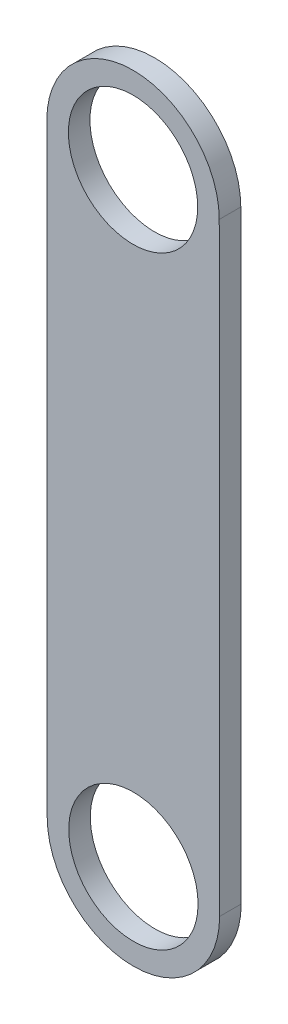
ISO-10303-21;
HEADER;
FILE_DESCRIPTION(('STEP AP214'),'2;1');
FILE_NAME('part.step','',(''),(''),'','','');
FILE_SCHEMA(('AUTOMOTIVE_DESIGN { 1 0 10303 214 1 1 1 1 }'));
ENDSEC;
DATA;
#1=APPLICATION_CONTEXT('core data for automotive mechanical design processes');
#2=APPLICATION_PROTOCOL_DEFINITION('international standard','automotive_design',2000,#1);
#3=PRODUCT_CONTEXT('',#1,'mechanical');
#4=PRODUCT('Part','Part','',(#3));
#5=PRODUCT_RELATED_PRODUCT_CATEGORY('part','',(#4));
#6=PRODUCT_DEFINITION_FORMATION('','',#4);
#7=PRODUCT_DEFINITION_CONTEXT('part definition',#1,'design');
#8=PRODUCT_DEFINITION('design','',#6,#7);
#9=PRODUCT_DEFINITION_SHAPE('','',#8);
#10=(LENGTH_UNIT() NAMED_UNIT(*) SI_UNIT(.MILLI.,.METRE.));
#11=(NAMED_UNIT(*) PLANE_ANGLE_UNIT() SI_UNIT($,.RADIAN.));
#12=(NAMED_UNIT(*) SI_UNIT($,.STERADIAN.) SOLID_ANGLE_UNIT());
#13=UNCERTAINTY_MEASURE_WITH_UNIT(LENGTH_MEASURE(1.E-05),#10,'distance_accuracy_value','');
#14=(GEOMETRIC_REPRESENTATION_CONTEXT(3) GLOBAL_UNCERTAINTY_ASSIGNED_CONTEXT((#13)) GLOBAL_UNIT_ASSIGNED_CONTEXT((#10,
#11,#12)) REPRESENTATION_CONTEXT('',''));
#15=CARTESIAN_POINT('',(0.,0.,0.));
#16=DIRECTION('',(0.,0.,1.));
#17=DIRECTION('',(1.,0.,0.));
#18=AXIS2_PLACEMENT_3D('',#15,#16,#17);
#19=CARTESIAN_POINT('',(-54.484155585902,-22.2361374727643,-1.));
#20=DIRECTION('',(0.,0.,1.));
#21=DIRECTION('',(1.,0.,0.));
#22=AXIS2_PLACEMENT_3D('',#19,#20,#21);
#23=CYLINDRICAL_SURFACE('',#22,4.00000000000001);
#24=CARTESIAN_POINT('',(-54.484155585902,-22.2361374727643,0.));
#25=DIRECTION('',(0.,0.,1.));
#26=DIRECTION('',(1.,0.,0.));
#27=AXIS2_PLACEMENT_3D('',#24,#25,#26);
#28=CIRCLE('',#27,4.00000000000001);
#29=CARTESIAN_POINT('',(-50.4841563307259,-22.2336964503954,0.));
#30=VERTEX_POINT('',#29);
#31=CARTESIAN_POINT('',(-58.4841548410782,-22.2385784951332,0.));
#32=VERTEX_POINT('',#31);
#33=EDGE_CURVE('E106',#30,#32,#28,.T.);
#34=ORIENTED_EDGE('',*,*,#33,.F.);
#35=DIRECTION('',(0.,0.,1.));
#36=VECTOR('',#35,1.);
#37=CARTESIAN_POINT('',(-50.4841563307259,-22.2336964503954,-1.));
#38=LINE('',#37,#36);
#39=CARTESIAN_POINT('',(-50.4841563307259,-22.2336964503954,-1.));
#40=VERTEX_POINT('',#39);
#41=EDGE_CURVE('E11',#40,#30,#38,.T.);
#42=ORIENTED_EDGE('',*,*,#41,.F.);
#43=CARTESIAN_POINT('',(-54.484155585902,-22.2361374727643,-1.));
#44=DIRECTION('',(0.,0.,1.));
#45=DIRECTION('',(1.,0.,0.));
#46=AXIS2_PLACEMENT_3D('',#43,#44,#45);
#47=CIRCLE('',#46,4.00000000000001);
#48=CARTESIAN_POINT('',(-58.4841548410782,-22.2385784951332,-1.));
#49=VERTEX_POINT('',#48);
#50=EDGE_CURVE('E99',#40,#49,#47,.T.);
#51=ORIENTED_EDGE('',*,*,#50,.T.);
#52=DIRECTION('',(0.,0.,1.));
#53=VECTOR('',#52,1.);
#54=CARTESIAN_POINT('',(-58.4841548410782,-22.2385784951332,-1.));
#55=LINE('',#54,#53);
#56=EDGE_CURVE('E44',#49,#32,#55,.T.);
#57=ORIENTED_EDGE('',*,*,#56,.T.);
#58=EDGE_LOOP('',(#34,#42,#51,#57));
#59=FACE_BOUND('',#58,.T.);
#60=ADVANCED_FACE('F41',(#59),#23,.T.);
#61=CARTESIAN_POINT('',(-50.4841563307259,-22.2336964503954,-1.));
#62=DIRECTION('',(0.999999813794039,0.000610255592227041,0.));
#63=DIRECTION('',(-0.000610255592227041,0.999999813794039,0.));
#64=AXIS2_PLACEMENT_3D('',#61,#62,#63);
#65=PLANE('',#64);
#66=DIRECTION('',(-0.000610255592227041,0.999999813794039,0.));
#67=VECTOR('',#66,1.);
#68=CARTESIAN_POINT('',(-50.4841563307259,-22.2336964503954,0.));
#69=LINE('',#68,#67);
#70=CARTESIAN_POINT('',(-50.4670691741435,-50.2336912366285,0.));
#71=VERTEX_POINT('',#70);
#72=EDGE_CURVE('E101',#71,#30,#69,.T.);
#73=ORIENTED_EDGE('',*,*,#72,.F.);
#74=DIRECTION('',(0.,0.,1.));
#75=VECTOR('',#74,1.);
#76=CARTESIAN_POINT('',(-50.4670691741435,-50.2336912366285,-1.));
#77=LINE('',#76,#75);
#78=CARTESIAN_POINT('',(-50.4670691741435,-50.2336912366285,-1.));
#79=VERTEX_POINT('',#78);
#80=EDGE_CURVE('E50',#79,#71,#77,.T.);
#81=ORIENTED_EDGE('',*,*,#80,.F.);
#82=DIRECTION('',(-0.000610255592227041,0.999999813794039,0.));
#83=VECTOR('',#82,1.);
#84=CARTESIAN_POINT('',(-50.4841563307259,-22.2336964503954,-1.));
#85=LINE('',#84,#83);
#86=EDGE_CURVE('E96',#79,#40,#85,.T.);
#87=ORIENTED_EDGE('',*,*,#86,.T.);
#88=ORIENTED_EDGE('',*,*,#41,.T.);
#89=EDGE_LOOP('',(#73,#81,#87,#88));
#90=FACE_BOUND('',#89,.T.);
#91=ADVANCED_FACE('F117',(#90),#65,.T.);
#92=CARTESIAN_POINT('',(-54.4670684293197,-50.2361322589974,-1.));
#93=DIRECTION('',(0.,0.,1.));
#94=DIRECTION('',(1.,0.,0.));
#95=AXIS2_PLACEMENT_3D('',#92,#93,#94);
#96=CYLINDRICAL_SURFACE('',#95,4.00000000000001);
#97=CARTESIAN_POINT('',(-54.4670684293197,-50.2361322589974,0.));
#98=DIRECTION('',(0.,0.,1.));
#99=DIRECTION('',(1.,0.,0.));
#100=AXIS2_PLACEMENT_3D('',#97,#98,#99);
#101=CIRCLE('',#100,4.00000000000001);
#102=CARTESIAN_POINT('',(-58.4670676844959,-50.2385732813663,0.));
#103=VERTEX_POINT('',#102);
#104=EDGE_CURVE('E91',#103,#71,#101,.T.);
#105=ORIENTED_EDGE('',*,*,#104,.F.);
#106=DIRECTION('',(0.,0.,1.));
#107=VECTOR('',#106,1.);
#108=CARTESIAN_POINT('',(-58.4670676844959,-50.2385732813663,-1.));
#109=LINE('',#108,#107);
#110=CARTESIAN_POINT('',(-58.4670676844959,-50.2385732813663,-1.));
#111=VERTEX_POINT('',#110);
#112=EDGE_CURVE('E86',#111,#103,#109,.T.);
#113=ORIENTED_EDGE('',*,*,#112,.F.);
#114=CARTESIAN_POINT('',(-54.4670684293197,-50.2361322589974,-1.));
#115=DIRECTION('',(0.,0.,1.));
#116=DIRECTION('',(1.,0.,0.));
#117=AXIS2_PLACEMENT_3D('',#114,#115,#116);
#118=CIRCLE('',#117,4.00000000000001);
#119=EDGE_CURVE('E89',#111,#79,#118,.T.);
#120=ORIENTED_EDGE('',*,*,#119,.T.);
#121=ORIENTED_EDGE('',*,*,#80,.T.);
#122=EDGE_LOOP('',(#105,#113,#120,#121));
#123=FACE_BOUND('',#122,.T.);
#124=ADVANCED_FACE('F88',(#123),#96,.T.);
#125=CARTESIAN_POINT('',(-58.4841548410782,-22.2385784951332,-1.));
#126=DIRECTION('',(-0.999999813794039,-0.000610255592227042,0.));
#127=DIRECTION('',(0.000610255592227042,-0.999999813794039,0.));
#128=AXIS2_PLACEMENT_3D('',#125,#126,#127);
#129=PLANE('',#128);
#130=DIRECTION('',(0.000610255592227041,-0.999999813794039,0.));
#131=VECTOR('',#130,1.);
#132=CARTESIAN_POINT('',(-58.4841548410782,-22.2385784951332,0.));
#133=LINE('',#132,#131);
#134=EDGE_CURVE('E109',#32,#103,#133,.T.);
#135=ORIENTED_EDGE('',*,*,#134,.F.);
#136=ORIENTED_EDGE('',*,*,#56,.F.);
#137=DIRECTION('',(0.000610255592227041,-0.999999813794039,0.));
#138=VECTOR('',#137,1.);
#139=CARTESIAN_POINT('',(-58.4841548410782,-22.2385784951332,-1.));
#140=LINE('',#139,#138);
#141=EDGE_CURVE('E95',#49,#111,#140,.T.);
#142=ORIENTED_EDGE('',*,*,#141,.T.);
#143=ORIENTED_EDGE('',*,*,#112,.T.);
#144=EDGE_LOOP('',(#135,#136,#142,#143));
#145=FACE_BOUND('',#144,.T.);
#146=ADVANCED_FACE('F98',(#145),#129,.T.);
#147=CARTESIAN_POINT('',(-54.484155585902,-22.2361374727643,-1.));
#148=DIRECTION('',(0.,0.,1.));
#149=DIRECTION('',(1.,0.,0.));
#150=AXIS2_PLACEMENT_3D('',#147,#148,#149);
#151=PLANE('',#150);
#152=CARTESIAN_POINT('',(-54.4670684293197,-50.2361322589974,-1.));
#153=DIRECTION('',(0.,0.,1.));
#154=DIRECTION('',(1.,0.,0.));
#155=AXIS2_PLACEMENT_3D('',#152,#153,#154);
#156=CIRCLE('',#155,3.00000000000001);
#157=CARTESIAN_POINT('',(-51.4670684293197,-50.2361322589974,-1.));
#158=VERTEX_POINT('',#157);
#159=EDGE_CURVE('E150',#158,#158,#156,.T.);
#160=ORIENTED_EDGE('',*,*,#159,.T.);
#161=EDGE_LOOP('',(#160));
#162=FACE_BOUND('',#161,.T.);
#163=CARTESIAN_POINT('',(-54.484155585902,-22.2361374727643,-1.));
#164=DIRECTION('',(0.,0.,1.));
#165=DIRECTION('',(1.,0.,0.));
#166=AXIS2_PLACEMENT_3D('',#163,#164,#165);
#167=CIRCLE('',#166,3.00000000000001);
#168=CARTESIAN_POINT('',(-51.484155585902,-22.2361374727643,-1.));
#169=VERTEX_POINT('',#168);
#170=EDGE_CURVE('E110',#169,#169,#167,.T.);
#171=ORIENTED_EDGE('',*,*,#170,.T.);
#172=EDGE_LOOP('',(#171));
#173=FACE_BOUND('',#172,.T.);
#174=ORIENTED_EDGE('',*,*,#50,.F.);
#175=ORIENTED_EDGE('',*,*,#86,.F.);
#176=ORIENTED_EDGE('',*,*,#119,.F.);
#177=ORIENTED_EDGE('',*,*,#141,.F.);
#178=EDGE_LOOP('',(#174,#175,#176,#177));
#179=FACE_BOUND('',#178,.T.);
#180=ADVANCED_FACE('F94',(#162,#173,#179),#151,.F.);
#181=CARTESIAN_POINT('',(-54.484155585902,-22.2361374727643,0.));
#182=DIRECTION('',(0.,0.,1.));
#183=DIRECTION('',(1.,0.,0.));
#184=AXIS2_PLACEMENT_3D('',#181,#182,#183);
#185=PLANE('',#184);
#186=CARTESIAN_POINT('',(-54.4670684293197,-50.2361322589974,0.));
#187=DIRECTION('',(0.,0.,1.));
#188=DIRECTION('',(1.,0.,0.));
#189=AXIS2_PLACEMENT_3D('',#186,#187,#188);
#190=CIRCLE('',#189,3.00000000000001);
#191=CARTESIAN_POINT('',(-51.4670684293197,-50.2361322589974,0.));
#192=VERTEX_POINT('',#191);
#193=EDGE_CURVE('E153',#192,#192,#190,.T.);
#194=ORIENTED_EDGE('',*,*,#193,.F.);
#195=EDGE_LOOP('',(#194));
#196=FACE_BOUND('',#195,.T.);
#197=CARTESIAN_POINT('',(-54.484155585902,-22.2361374727643,0.));
#198=DIRECTION('',(0.,0.,1.));
#199=DIRECTION('',(1.,0.,0.));
#200=AXIS2_PLACEMENT_3D('',#197,#198,#199);
#201=CIRCLE('',#200,3.00000000000001);
#202=CARTESIAN_POINT('',(-51.484155585902,-22.2361374727643,0.));
#203=VERTEX_POINT('',#202);
#204=EDGE_CURVE('E155',#203,#203,#201,.T.);
#205=ORIENTED_EDGE('',*,*,#204,.F.);
#206=EDGE_LOOP('',(#205));
#207=FACE_BOUND('',#206,.T.);
#208=ORIENTED_EDGE('',*,*,#33,.T.);
#209=ORIENTED_EDGE('',*,*,#134,.T.);
#210=ORIENTED_EDGE('',*,*,#104,.T.);
#211=ORIENTED_EDGE('',*,*,#72,.T.);
#212=EDGE_LOOP('',(#208,#209,#210,#211));
#213=FACE_BOUND('',#212,.T.);
#214=ADVANCED_FACE('F116',(#196,#207,#213),#185,.T.);
#215=CARTESIAN_POINT('',(-54.484155585902,-22.2361374727643,-1.));
#216=DIRECTION('',(0.,0.,1.));
#217=DIRECTION('',(1.,0.,0.));
#218=AXIS2_PLACEMENT_3D('',#215,#216,#217);
#219=CYLINDRICAL_SURFACE('',#218,3.00000000000001);
#220=ORIENTED_EDGE('',*,*,#170,.F.);
#221=EDGE_LOOP('',(#220));
#222=FACE_BOUND('',#221,.T.);
#223=ORIENTED_EDGE('',*,*,#204,.T.);
#224=EDGE_LOOP('',(#223));
#225=FACE_BOUND('',#224,.T.);
#226=ADVANCED_FACE('F135',(#222,#225),#219,.F.);
#227=CARTESIAN_POINT('',(-54.4670684293197,-50.2361322589974,-1.));
#228=DIRECTION('',(0.,0.,1.));
#229=DIRECTION('',(1.,0.,0.));
#230=AXIS2_PLACEMENT_3D('',#227,#228,#229);
#231=CYLINDRICAL_SURFACE('',#230,3.00000000000001);
#232=ORIENTED_EDGE('',*,*,#159,.F.);
#233=EDGE_LOOP('',(#232));
#234=FACE_BOUND('',#233,.T.);
#235=ORIENTED_EDGE('',*,*,#193,.T.);
#236=EDGE_LOOP('',(#235));
#237=FACE_BOUND('',#236,.T.);
#238=ADVANCED_FACE('F142',(#234,#237),#231,.F.);
#239=CLOSED_SHELL('',(#60,#91,#124,#146,#180,#214,#226,#238));
#240=MANIFOLD_SOLID_BREP('B2',#239);
#241=ADVANCED_BREP_SHAPE_REPRESENTATION('',(#18,#240),#14);
#242=SHAPE_DEFINITION_REPRESENTATION(#9,#241);
ENDSEC;
END-ISO-10303-21;
